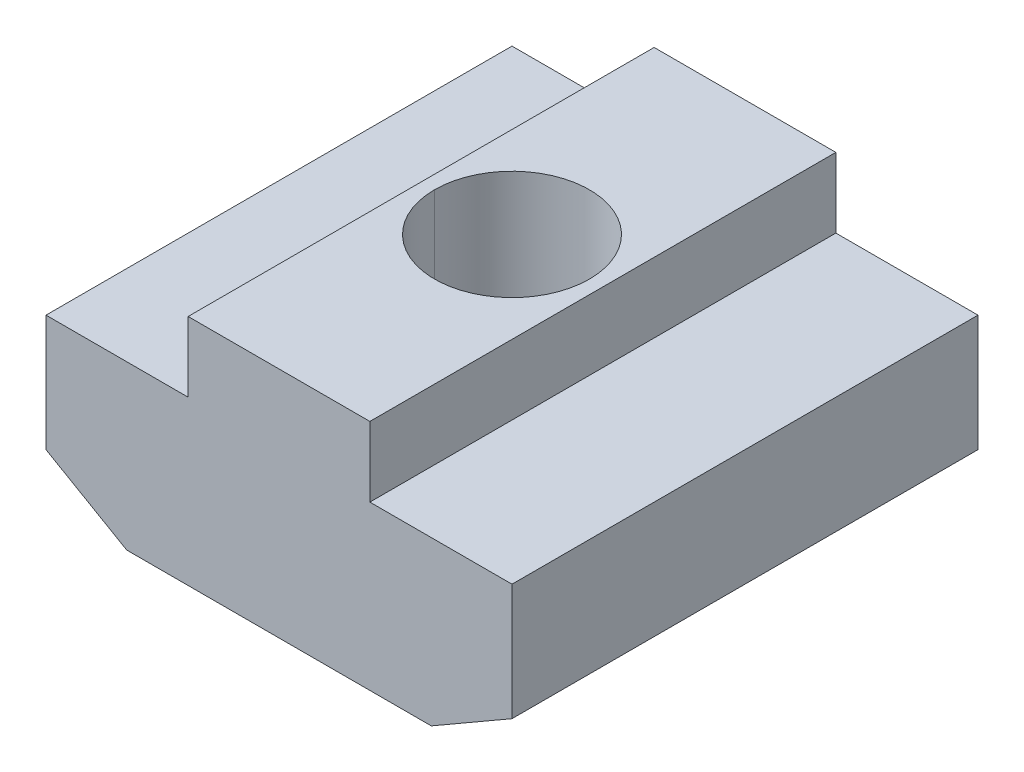
ISO-10303-21;
HEADER;
FILE_DESCRIPTION(('STEP AP214'),'2;1');
FILE_NAME('part.step','',(''),(''),'','','');
FILE_SCHEMA(('AUTOMOTIVE_DESIGN { 1 0 10303 214 1 1 1 1 }'));
ENDSEC;
DATA;
#1=APPLICATION_CONTEXT('core data for automotive mechanical design processes');
#2=APPLICATION_PROTOCOL_DEFINITION('international standard','automotive_design',2000,#1);
#3=PRODUCT_CONTEXT('',#1,'mechanical');
#4=PRODUCT('Part','Part','',(#3));
#5=PRODUCT_RELATED_PRODUCT_CATEGORY('part','',(#4));
#6=PRODUCT_DEFINITION_FORMATION('','',#4);
#7=PRODUCT_DEFINITION_CONTEXT('part definition',#1,'design');
#8=PRODUCT_DEFINITION('design','',#6,#7);
#9=PRODUCT_DEFINITION_SHAPE('','',#8);
#10=(LENGTH_UNIT() NAMED_UNIT(*) SI_UNIT(.MILLI.,.METRE.));
#11=(NAMED_UNIT(*) PLANE_ANGLE_UNIT() SI_UNIT($,.RADIAN.));
#12=(NAMED_UNIT(*) SI_UNIT($,.STERADIAN.) SOLID_ANGLE_UNIT());
#13=UNCERTAINTY_MEASURE_WITH_UNIT(LENGTH_MEASURE(1.E-05),#10,'distance_accuracy_value','');
#14=(GEOMETRIC_REPRESENTATION_CONTEXT(3) GLOBAL_UNCERTAINTY_ASSIGNED_CONTEXT((#13)) GLOBAL_UNIT_ASSIGNED_CONTEXT((#10,
#11,#12)) REPRESENTATION_CONTEXT('',''));
#15=CARTESIAN_POINT('',(0.,0.,0.));
#16=DIRECTION('',(0.,0.,1.));
#17=DIRECTION('',(1.,0.,0.));
#18=AXIS2_PLACEMENT_3D('',#15,#16,#17);
#19=CARTESIAN_POINT('',(-10.,-1.5,0.));
#20=DIRECTION('',(0.50000000000019,0.866025403784329,0.));
#21=DIRECTION('',(0.,0.,-1.));
#22=AXIS2_PLACEMENT_3D('',#19,#20,#21);
#23=PLANE('',#22);
#24=DIRECTION('',(0.,0.,1.));
#25=VECTOR('',#24,1.);
#26=CARTESIAN_POINT('',(-10.,-1.5,0.));
#27=LINE('',#26,#25);
#28=CARTESIAN_POINT('',(-10.,-1.5,-10.));
#29=VERTEX_POINT('',#28);
#30=CARTESIAN_POINT('',(-10.,-1.5,10.));
#31=VERTEX_POINT('',#30);
#32=EDGE_CURVE('E187',#29,#31,#27,.T.);
#33=ORIENTED_EDGE('',*,*,#32,.F.);
#34=DIRECTION('',(0.866025403784329,-0.50000000000019,0.));
#35=VECTOR('',#34,1.);
#36=CARTESIAN_POINT('',(-8.26794919243,-2.5,-10.));
#37=LINE('',#36,#35);
#38=CARTESIAN_POINT('',(-6.53589838486,-3.5,-10.));
#39=VERTEX_POINT('',#38);
#40=EDGE_CURVE('E194',#29,#39,#37,.T.);
#41=ORIENTED_EDGE('',*,*,#40,.T.);
#42=DIRECTION('',(0.,0.,1.));
#43=VECTOR('',#42,1.);
#44=CARTESIAN_POINT('',(-6.53589838486,-3.5,0.));
#45=LINE('',#44,#43);
#46=CARTESIAN_POINT('',(-6.53589838486,-3.5,10.));
#47=VERTEX_POINT('',#46);
#48=EDGE_CURVE('E11',#39,#47,#45,.T.);
#49=ORIENTED_EDGE('',*,*,#48,.T.);
#50=DIRECTION('',(-0.866025403784329,0.50000000000019,0.));
#51=VECTOR('',#50,1.);
#52=CARTESIAN_POINT('',(-8.26794919243,-2.5,10.));
#53=LINE('',#52,#51);
#54=EDGE_CURVE('E20',#47,#31,#53,.T.);
#55=ORIENTED_EDGE('',*,*,#54,.T.);
#56=EDGE_LOOP('',(#33,#41,#49,#55));
#57=FACE_BOUND('',#56,.T.);
#58=ADVANCED_FACE('F17',(#57),#23,.F.);
#59=CARTESIAN_POINT('',(10.,-3.5,0.));
#60=DIRECTION('',(0.,1.,0.));
#61=DIRECTION('',(1.,0.,0.));
#62=AXIS2_PLACEMENT_3D('',#59,#60,#61);
#63=PLANE('',#62);
#64=CARTESIAN_POINT('',(0.,-3.5,0.));
#65=DIRECTION('',(0.,1.,0.));
#66=DIRECTION('',(1.,0.,0.));
#67=AXIS2_PLACEMENT_3D('',#64,#65,#66);
#68=CIRCLE('',#67,3.3235);
#69=CARTESIAN_POINT('',(-3.3235,-3.5,0.));
#70=VERTEX_POINT('',#69);
#71=CARTESIAN_POINT('',(3.3235,-3.5,0.));
#72=VERTEX_POINT('',#71);
#73=EDGE_CURVE('E231',#70,#72,#68,.T.);
#74=ORIENTED_EDGE('',*,*,#73,.T.);
#75=CARTESIAN_POINT('',(0.,-3.5,0.));
#76=DIRECTION('',(0.,1.,0.));
#77=DIRECTION('',(1.,0.,0.));
#78=AXIS2_PLACEMENT_3D('',#75,#76,#77);
#79=CIRCLE('',#78,3.3235);
#80=EDGE_CURVE('E245',#72,#70,#79,.T.);
#81=ORIENTED_EDGE('',*,*,#80,.T.);
#82=EDGE_LOOP('',(#74,#81));
#83=FACE_BOUND('',#82,.T.);
#84=ORIENTED_EDGE('',*,*,#48,.F.);
#85=DIRECTION('',(1.,0.,0.));
#86=VECTOR('',#85,1.);
#87=CARTESIAN_POINT('',(0.,-3.5,-10.));
#88=LINE('',#87,#86);
#89=CARTESIAN_POINT('',(6.53589838486,-3.5,-10.));
#90=VERTEX_POINT('',#89);
#91=EDGE_CURVE('E197',#39,#90,#88,.T.);
#92=ORIENTED_EDGE('',*,*,#91,.T.);
#93=DIRECTION('',(0.,0.,1.));
#94=VECTOR('',#93,1.);
#95=CARTESIAN_POINT('',(6.53589838486,-3.5,0.));
#96=LINE('',#95,#94);
#97=CARTESIAN_POINT('',(6.53589838486,-3.5,10.));
#98=VERTEX_POINT('',#97);
#99=EDGE_CURVE('E173',#90,#98,#96,.T.);
#100=ORIENTED_EDGE('',*,*,#99,.T.);
#101=DIRECTION('',(1.,0.,0.));
#102=VECTOR('',#101,1.);
#103=CARTESIAN_POINT('',(0.,-3.5,10.));
#104=LINE('',#103,#102);
#105=EDGE_CURVE('E199',#47,#98,#104,.T.);
#106=ORIENTED_EDGE('',*,*,#105,.F.);
#107=EDGE_LOOP('',(#84,#92,#100,#106));
#108=FACE_BOUND('',#107,.T.);
#109=ADVANCED_FACE('F222',(#83,#108),#63,.F.);
#110=CARTESIAN_POINT('',(0.,0.,10.));
#111=DIRECTION('',(0.,0.,1.));
#112=DIRECTION('',(1.,0.,0.));
#113=AXIS2_PLACEMENT_3D('',#110,#111,#112);
#114=PLANE('',#113);
#115=ORIENTED_EDGE('',*,*,#105,.T.);
#116=DIRECTION('',(-0.866025403784329,-0.50000000000019,0.));
#117=VECTOR('',#116,1.);
#118=CARTESIAN_POINT('',(8.26794919243,-2.5,10.));
#119=LINE('',#118,#117);
#120=CARTESIAN_POINT('',(10.,-1.5,10.));
#121=VERTEX_POINT('',#120);
#122=EDGE_CURVE('E181',#121,#98,#119,.T.);
#123=ORIENTED_EDGE('',*,*,#122,.F.);
#124=DIRECTION('',(0.,1.,0.));
#125=VECTOR('',#124,1.);
#126=CARTESIAN_POINT('',(10.,1.,10.));
#127=LINE('',#126,#125);
#128=CARTESIAN_POINT('',(10.,3.5,10.));
#129=VERTEX_POINT('',#128);
#130=EDGE_CURVE('E153',#121,#129,#127,.T.);
#131=ORIENTED_EDGE('',*,*,#130,.T.);
#132=DIRECTION('',(-1.,0.,0.));
#133=VECTOR('',#132,1.);
#134=CARTESIAN_POINT('',(6.95,3.5,10.));
#135=LINE('',#134,#133);
#136=CARTESIAN_POINT('',(3.9,3.5,10.));
#137=VERTEX_POINT('',#136);
#138=EDGE_CURVE('E150',#129,#137,#135,.T.);
#139=ORIENTED_EDGE('',*,*,#138,.T.);
#140=DIRECTION('',(0.,1.,0.));
#141=VECTOR('',#140,1.);
#142=CARTESIAN_POINT('',(3.9,5.,10.));
#143=LINE('',#142,#141);
#144=CARTESIAN_POINT('',(3.9,6.5,10.));
#145=VERTEX_POINT('',#144);
#146=EDGE_CURVE('E134',#137,#145,#143,.T.);
#147=ORIENTED_EDGE('',*,*,#146,.T.);
#148=DIRECTION('',(-1.,0.,0.));
#149=VECTOR('',#148,1.);
#150=CARTESIAN_POINT('',(0.,6.5,10.));
#151=LINE('',#150,#149);
#152=CARTESIAN_POINT('',(-3.9,6.5,10.));
#153=VERTEX_POINT('',#152);
#154=EDGE_CURVE('E274',#145,#153,#151,.T.);
#155=ORIENTED_EDGE('',*,*,#154,.T.);
#156=DIRECTION('',(0.,-1.,0.));
#157=VECTOR('',#156,1.);
#158=CARTESIAN_POINT('',(-3.9,5.,10.));
#159=LINE('',#158,#157);
#160=CARTESIAN_POINT('',(-3.9,3.5,10.));
#161=VERTEX_POINT('',#160);
#162=EDGE_CURVE('E240',#153,#161,#159,.T.);
#163=ORIENTED_EDGE('',*,*,#162,.T.);
#164=DIRECTION('',(-1.,0.,0.));
#165=VECTOR('',#164,1.);
#166=CARTESIAN_POINT('',(-6.95,3.5,10.));
#167=LINE('',#166,#165);
#168=CARTESIAN_POINT('',(-10.,3.5,10.));
#169=VERTEX_POINT('',#168);
#170=EDGE_CURVE('E208',#161,#169,#167,.T.);
#171=ORIENTED_EDGE('',*,*,#170,.T.);
#172=DIRECTION('',(0.,-1.,0.));
#173=VECTOR('',#172,1.);
#174=CARTESIAN_POINT('',(-10.,1.,10.));
#175=LINE('',#174,#173);
#176=EDGE_CURVE('E182',#169,#31,#175,.T.);
#177=ORIENTED_EDGE('',*,*,#176,.T.);
#178=ORIENTED_EDGE('',*,*,#54,.F.);
#179=EDGE_LOOP('',(#115,#123,#131,#139,#147,#155,#163,#171,#177,#178));
#180=FACE_BOUND('',#179,.T.);
#181=ADVANCED_FACE('F151',(#180),#114,.T.);
#182=CARTESIAN_POINT('',(0.,0.,-10.));
#183=DIRECTION('',(0.,0.,1.));
#184=DIRECTION('',(1.,0.,0.));
#185=AXIS2_PLACEMENT_3D('',#182,#183,#184);
#186=PLANE('',#185);
#187=ORIENTED_EDGE('',*,*,#40,.F.);
#188=DIRECTION('',(0.,-1.,0.));
#189=VECTOR('',#188,1.);
#190=CARTESIAN_POINT('',(-10.,1.,-10.));
#191=LINE('',#190,#189);
#192=CARTESIAN_POINT('',(-10.,3.5,-10.));
#193=VERTEX_POINT('',#192);
#194=EDGE_CURVE('E186',#193,#29,#191,.T.);
#195=ORIENTED_EDGE('',*,*,#194,.F.);
#196=DIRECTION('',(-1.,0.,0.));
#197=VECTOR('',#196,1.);
#198=CARTESIAN_POINT('',(-6.95,3.5,-10.));
#199=LINE('',#198,#197);
#200=CARTESIAN_POINT('',(-3.9,3.5,-10.));
#201=VERTEX_POINT('',#200);
#202=EDGE_CURVE('E217',#201,#193,#199,.T.);
#203=ORIENTED_EDGE('',*,*,#202,.F.);
#204=DIRECTION('',(0.,-1.,0.));
#205=VECTOR('',#204,1.);
#206=CARTESIAN_POINT('',(-3.9,5.,-10.));
#207=LINE('',#206,#205);
#208=CARTESIAN_POINT('',(-3.9,6.5,-10.));
#209=VERTEX_POINT('',#208);
#210=EDGE_CURVE('E279',#209,#201,#207,.T.);
#211=ORIENTED_EDGE('',*,*,#210,.F.);
#212=DIRECTION('',(-1.,0.,0.));
#213=VECTOR('',#212,1.);
#214=CARTESIAN_POINT('',(0.,6.5,-10.));
#215=LINE('',#214,#213);
#216=CARTESIAN_POINT('',(3.9,6.5,-10.));
#217=VERTEX_POINT('',#216);
#218=EDGE_CURVE('E266',#217,#209,#215,.T.);
#219=ORIENTED_EDGE('',*,*,#218,.F.);
#220=DIRECTION('',(0.,1.,0.));
#221=VECTOR('',#220,1.);
#222=CARTESIAN_POINT('',(3.9,5.,-10.));
#223=LINE('',#222,#221);
#224=CARTESIAN_POINT('',(3.9,3.5,-10.));
#225=VERTEX_POINT('',#224);
#226=EDGE_CURVE('E147',#225,#217,#223,.T.);
#227=ORIENTED_EDGE('',*,*,#226,.F.);
#228=DIRECTION('',(-1.,0.,0.));
#229=VECTOR('',#228,1.);
#230=CARTESIAN_POINT('',(6.95,3.5,-10.));
#231=LINE('',#230,#229);
#232=CARTESIAN_POINT('',(10.,3.5,-10.));
#233=VERTEX_POINT('',#232);
#234=EDGE_CURVE('E161',#233,#225,#231,.T.);
#235=ORIENTED_EDGE('',*,*,#234,.F.);
#236=DIRECTION('',(0.,1.,0.));
#237=VECTOR('',#236,1.);
#238=CARTESIAN_POINT('',(10.,1.,-10.));
#239=LINE('',#238,#237);
#240=CARTESIAN_POINT('',(10.,-1.5,-10.));
#241=VERTEX_POINT('',#240);
#242=EDGE_CURVE('E174',#241,#233,#239,.T.);
#243=ORIENTED_EDGE('',*,*,#242,.F.);
#244=DIRECTION('',(0.866025403784329,0.50000000000019,0.));
#245=VECTOR('',#244,1.);
#246=CARTESIAN_POINT('',(8.26794919243,-2.5,-10.));
#247=LINE('',#246,#245);
#248=EDGE_CURVE('E178',#90,#241,#247,.T.);
#249=ORIENTED_EDGE('',*,*,#248,.F.);
#250=ORIENTED_EDGE('',*,*,#91,.F.);
#251=EDGE_LOOP('',(#187,#195,#203,#211,#219,#227,#235,#243,#249,#250));
#252=FACE_BOUND('',#251,.T.);
#253=ADVANCED_FACE('F216',(#252),#186,.F.);
#254=CARTESIAN_POINT('',(-10.,-3.5,0.));
#255=DIRECTION('',(1.,0.,0.));
#256=DIRECTION('',(0.,1.,0.));
#257=AXIS2_PLACEMENT_3D('',#254,#255,#256);
#258=PLANE('',#257);
#259=ORIENTED_EDGE('',*,*,#32,.T.);
#260=ORIENTED_EDGE('',*,*,#176,.F.);
#261=DIRECTION('',(0.,0.,1.));
#262=VECTOR('',#261,1.);
#263=CARTESIAN_POINT('',(-10.,3.5,0.));
#264=LINE('',#263,#262);
#265=EDGE_CURVE('E213',#193,#169,#264,.T.);
#266=ORIENTED_EDGE('',*,*,#265,.F.);
#267=ORIENTED_EDGE('',*,*,#194,.T.);
#268=EDGE_LOOP('',(#259,#260,#266,#267));
#269=FACE_BOUND('',#268,.T.);
#270=ADVANCED_FACE('F212',(#269),#258,.F.);
#271=CARTESIAN_POINT('',(10.,-1.5,0.));
#272=DIRECTION('',(-0.50000000000019,0.866025403784329,0.));
#273=DIRECTION('',(0.,0.,1.));
#274=AXIS2_PLACEMENT_3D('',#271,#272,#273);
#275=PLANE('',#274);
#276=ORIENTED_EDGE('',*,*,#99,.F.);
#277=ORIENTED_EDGE('',*,*,#248,.T.);
#278=DIRECTION('',(0.,0.,1.));
#279=VECTOR('',#278,1.);
#280=CARTESIAN_POINT('',(10.,-1.5,0.));
#281=LINE('',#280,#279);
#282=EDGE_CURVE('E146',#241,#121,#281,.T.);
#283=ORIENTED_EDGE('',*,*,#282,.T.);
#284=ORIENTED_EDGE('',*,*,#122,.T.);
#285=EDGE_LOOP('',(#276,#277,#283,#284));
#286=FACE_BOUND('',#285,.T.);
#287=ADVANCED_FACE('F224',(#286),#275,.F.);
#288=CARTESIAN_POINT('',(10.,3.5,0.));
#289=DIRECTION('',(-1.,0.,0.));
#290=DIRECTION('',(0.,0.,1.));
#291=AXIS2_PLACEMENT_3D('',#288,#289,#290);
#292=PLANE('',#291);
#293=ORIENTED_EDGE('',*,*,#282,.F.);
#294=ORIENTED_EDGE('',*,*,#242,.T.);
#295=DIRECTION('',(0.,0.,1.));
#296=VECTOR('',#295,1.);
#297=CARTESIAN_POINT('',(10.,3.5,0.));
#298=LINE('',#297,#296);
#299=EDGE_CURVE('E167',#233,#129,#298,.T.);
#300=ORIENTED_EDGE('',*,*,#299,.T.);
#301=ORIENTED_EDGE('',*,*,#130,.F.);
#302=EDGE_LOOP('',(#293,#294,#300,#301));
#303=FACE_BOUND('',#302,.T.);
#304=ADVANCED_FACE('F291',(#303),#292,.F.);
#305=CARTESIAN_POINT('',(3.9,6.5,0.));
#306=DIRECTION('',(-1.,0.,0.));
#307=DIRECTION('',(0.,0.,1.));
#308=AXIS2_PLACEMENT_3D('',#305,#306,#307);
#309=PLANE('',#308);
#310=DIRECTION('',(0.,0.,1.));
#311=VECTOR('',#310,1.);
#312=CARTESIAN_POINT('',(3.9,3.5,0.));
#313=LINE('',#312,#311);
#314=EDGE_CURVE('E138',#225,#137,#313,.T.);
#315=ORIENTED_EDGE('',*,*,#314,.F.);
#316=ORIENTED_EDGE('',*,*,#226,.T.);
#317=DIRECTION('',(0.,0.,1.));
#318=VECTOR('',#317,1.);
#319=CARTESIAN_POINT('',(3.9,6.5,0.));
#320=LINE('',#319,#318);
#321=EDGE_CURVE('E141',#217,#145,#320,.T.);
#322=ORIENTED_EDGE('',*,*,#321,.T.);
#323=ORIENTED_EDGE('',*,*,#146,.F.);
#324=EDGE_LOOP('',(#315,#316,#322,#323));
#325=FACE_BOUND('',#324,.T.);
#326=ADVANCED_FACE('F136',(#325),#309,.F.);
#327=CARTESIAN_POINT('',(3.9,3.5,0.));
#328=DIRECTION('',(0.,-1.,0.));
#329=DIRECTION('',(0.,0.,-1.));
#330=AXIS2_PLACEMENT_3D('',#327,#328,#329);
#331=PLANE('',#330);
#332=ORIENTED_EDGE('',*,*,#299,.F.);
#333=ORIENTED_EDGE('',*,*,#234,.T.);
#334=ORIENTED_EDGE('',*,*,#314,.T.);
#335=ORIENTED_EDGE('',*,*,#138,.F.);
#336=EDGE_LOOP('',(#332,#333,#334,#335));
#337=FACE_BOUND('',#336,.T.);
#338=ADVANCED_FACE('F159',(#337),#331,.F.);
#339=CARTESIAN_POINT('',(3.9,3.5,0.));
#340=DIRECTION('',(0.,-1.,0.));
#341=DIRECTION('',(0.,0.,-1.));
#342=AXIS2_PLACEMENT_3D('',#339,#340,#341);
#343=PLANE('',#342);
#344=DIRECTION('',(0.,0.,1.));
#345=VECTOR('',#344,1.);
#346=CARTESIAN_POINT('',(-3.9,3.5,0.));
#347=LINE('',#346,#345);
#348=EDGE_CURVE('E275',#201,#161,#347,.T.);
#349=ORIENTED_EDGE('',*,*,#348,.F.);
#350=ORIENTED_EDGE('',*,*,#202,.T.);
#351=ORIENTED_EDGE('',*,*,#265,.T.);
#352=ORIENTED_EDGE('',*,*,#170,.F.);
#353=EDGE_LOOP('',(#349,#350,#351,#352));
#354=FACE_BOUND('',#353,.T.);
#355=ADVANCED_FACE('F299',(#354),#343,.F.);
#356=CARTESIAN_POINT('',(-3.9,3.5,0.));
#357=DIRECTION('',(1.,0.,0.));
#358=DIRECTION('',(0.,1.,0.));
#359=AXIS2_PLACEMENT_3D('',#356,#357,#358);
#360=PLANE('',#359);
#361=DIRECTION('',(0.,0.,1.));
#362=VECTOR('',#361,1.);
#363=CARTESIAN_POINT('',(-3.9,6.5,0.));
#364=LINE('',#363,#362);
#365=EDGE_CURVE('E270',#209,#153,#364,.T.);
#366=ORIENTED_EDGE('',*,*,#365,.F.);
#367=ORIENTED_EDGE('',*,*,#210,.T.);
#368=ORIENTED_EDGE('',*,*,#348,.T.);
#369=ORIENTED_EDGE('',*,*,#162,.F.);
#370=EDGE_LOOP('',(#366,#367,#368,#369));
#371=FACE_BOUND('',#370,.T.);
#372=ADVANCED_FACE('F297',(#371),#360,.F.);
#373=CARTESIAN_POINT('',(-3.9,6.5,0.));
#374=DIRECTION('',(0.,-1.,0.));
#375=DIRECTION('',(0.,0.,-1.));
#376=AXIS2_PLACEMENT_3D('',#373,#374,#375);
#377=PLANE('',#376);
#378=CARTESIAN_POINT('',(0.,6.5,0.));
#379=DIRECTION('',(0.,1.,0.));
#380=DIRECTION('',(1.,0.,0.));
#381=AXIS2_PLACEMENT_3D('',#378,#379,#380);
#382=CIRCLE('',#381,3.3235);
#383=CARTESIAN_POINT('',(-3.3235,6.5,0.));
#384=VERTEX_POINT('',#383);
#385=CARTESIAN_POINT('',(3.3235,6.5,0.));
#386=VERTEX_POINT('',#385);
#387=EDGE_CURVE('E244',#384,#386,#382,.T.);
#388=ORIENTED_EDGE('',*,*,#387,.F.);
#389=CARTESIAN_POINT('',(0.,6.5,0.));
#390=DIRECTION('',(0.,1.,0.));
#391=DIRECTION('',(1.,0.,0.));
#392=AXIS2_PLACEMENT_3D('',#389,#390,#391);
#393=CIRCLE('',#392,3.3235);
#394=EDGE_CURVE('E248',#386,#384,#393,.T.);
#395=ORIENTED_EDGE('',*,*,#394,.F.);
#396=EDGE_LOOP('',(#388,#395));
#397=FACE_BOUND('',#396,.T.);
#398=ORIENTED_EDGE('',*,*,#321,.F.);
#399=ORIENTED_EDGE('',*,*,#218,.T.);
#400=ORIENTED_EDGE('',*,*,#365,.T.);
#401=ORIENTED_EDGE('',*,*,#154,.F.);
#402=EDGE_LOOP('',(#398,#399,#400,#401));
#403=FACE_BOUND('',#402,.T.);
#404=ADVANCED_FACE('F295',(#397,#403),#377,.F.);
#405=CARTESIAN_POINT('',(0.,-3.5,0.));
#406=DIRECTION('',(0.,1.,0.));
#407=DIRECTION('',(1.,0.,0.));
#408=AXIS2_PLACEMENT_3D('',#405,#406,#407);
#409=CYLINDRICAL_SURFACE('',#408,3.3235);
#410=ORIENTED_EDGE('',*,*,#80,.F.);
#411=DIRECTION('',(0.,-1.,0.));
#412=VECTOR('',#411,1.);
#413=CARTESIAN_POINT('',(3.3235,1.34499999996,0.));
#414=LINE('',#413,#412);
#415=EDGE_CURVE('E249',#386,#72,#414,.T.);
#416=ORIENTED_EDGE('',*,*,#415,.F.);
#417=ORIENTED_EDGE('',*,*,#394,.T.);
#418=DIRECTION('',(0.,-1.,0.));
#419=VECTOR('',#418,1.);
#420=CARTESIAN_POINT('',(-3.3235,1.34499999996,0.));
#421=LINE('',#420,#419);
#422=EDGE_CURVE('E235',#384,#70,#421,.T.);
#423=ORIENTED_EDGE('',*,*,#422,.T.);
#424=EDGE_LOOP('',(#410,#416,#417,#423));
#425=FACE_BOUND('',#424,.T.);
#426=ADVANCED_FACE('F481',(#425),#409,.F.);
#427=CARTESIAN_POINT('',(0.,-3.5,0.));
#428=DIRECTION('',(0.,1.,0.));
#429=DIRECTION('',(1.,0.,0.));
#430=AXIS2_PLACEMENT_3D('',#427,#428,#429);
#431=CYLINDRICAL_SURFACE('',#430,3.3235);
#432=ORIENTED_EDGE('',*,*,#73,.F.);
#433=ORIENTED_EDGE('',*,*,#422,.F.);
#434=ORIENTED_EDGE('',*,*,#387,.T.);
#435=ORIENTED_EDGE('',*,*,#415,.T.);
#436=EDGE_LOOP('',(#432,#433,#434,#435));
#437=FACE_BOUND('',#436,.T.);
#438=ADVANCED_FACE('F492',(#437),#431,.F.);
#439=CLOSED_SHELL('',(#58,#109,#181,#253,#270,#287,#304,#326,#338,#355,#372,#404,#426,#438));
#440=MANIFOLD_SOLID_BREP('B1',#439);
#441=ADVANCED_BREP_SHAPE_REPRESENTATION('',(#18,#440),#14);
#442=SHAPE_DEFINITION_REPRESENTATION(#9,#441);
ENDSEC;
END-ISO-10303-21;
